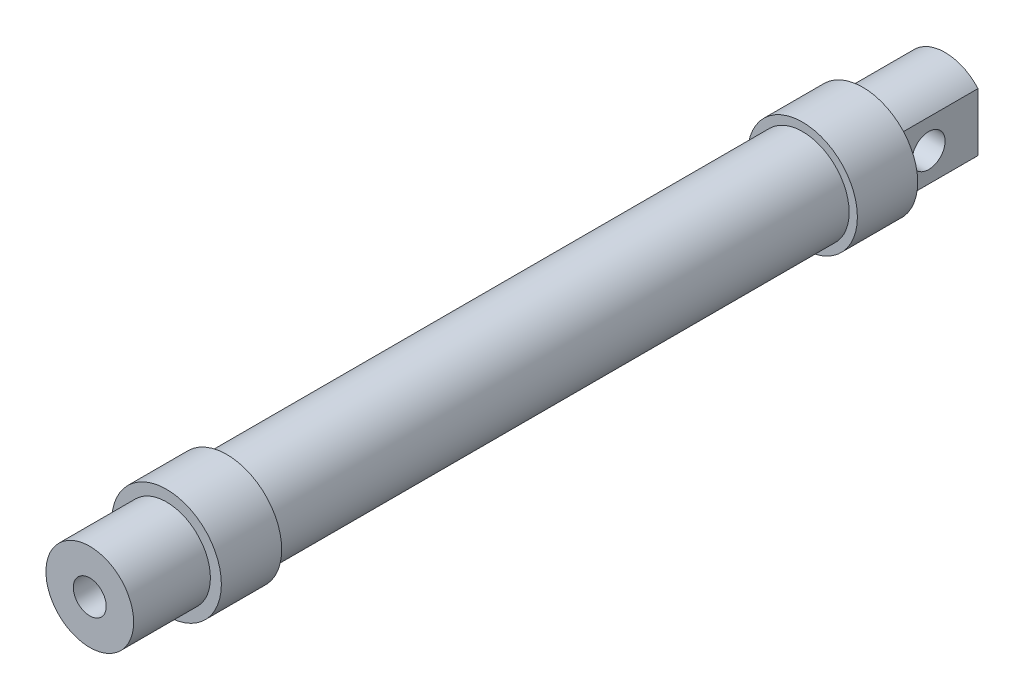
ISO-10303-21;
HEADER;
FILE_DESCRIPTION(('STEP AP214'),'2;1');
FILE_NAME('part.step','',(''),(''),'','','');
FILE_SCHEMA(('AUTOMOTIVE_DESIGN { 1 0 10303 214 1 1 1 1 }'));
ENDSEC;
DATA;
#1=APPLICATION_CONTEXT('core data for automotive mechanical design processes');
#2=APPLICATION_PROTOCOL_DEFINITION('international standard','automotive_design',2000,#1);
#3=PRODUCT_CONTEXT('',#1,'mechanical');
#4=PRODUCT('Part','Part','',(#3));
#5=PRODUCT_RELATED_PRODUCT_CATEGORY('part','',(#4));
#6=PRODUCT_DEFINITION_FORMATION('','',#4);
#7=PRODUCT_DEFINITION_CONTEXT('part definition',#1,'design');
#8=PRODUCT_DEFINITION('design','',#6,#7);
#9=PRODUCT_DEFINITION_SHAPE('','',#8);
#10=(LENGTH_UNIT() NAMED_UNIT(*) SI_UNIT(.MILLI.,.METRE.));
#11=(NAMED_UNIT(*) PLANE_ANGLE_UNIT() SI_UNIT($,.RADIAN.));
#12=(NAMED_UNIT(*) SI_UNIT($,.STERADIAN.) SOLID_ANGLE_UNIT());
#13=UNCERTAINTY_MEASURE_WITH_UNIT(LENGTH_MEASURE(1.E-05),#10,'distance_accuracy_value','');
#14=(GEOMETRIC_REPRESENTATION_CONTEXT(3) GLOBAL_UNCERTAINTY_ASSIGNED_CONTEXT((#13)) GLOBAL_UNIT_ASSIGNED_CONTEXT((#10,
#11,#12)) REPRESENTATION_CONTEXT('',''));
#15=CARTESIAN_POINT('',(0.,0.,0.));
#16=DIRECTION('',(0.,0.,1.));
#17=DIRECTION('',(1.,0.,0.));
#18=AXIS2_PLACEMENT_3D('',#15,#16,#17);
#19=CARTESIAN_POINT('',(0.,0.,15.));
#20=DIRECTION('',(0.,0.,-1.));
#21=DIRECTION('',(-1.,0.,0.));
#22=AXIS2_PLACEMENT_3D('',#19,#20,#21);
#23=CYLINDRICAL_SURFACE('',#22,8.);
#24=CARTESIAN_POINT('',(0.,0.,0.));
#25=DIRECTION('',(0.,0.,1.));
#26=DIRECTION('',(1.,0.,0.));
#27=AXIS2_PLACEMENT_3D('',#24,#25,#26);
#28=CIRCLE('',#27,8.);
#29=CARTESIAN_POINT('',(-6.,-5.29150262212918,0.));
#30=VERTEX_POINT('',#29);
#31=CARTESIAN_POINT('',(6.,-5.29150262212919,0.));
#32=VERTEX_POINT('',#31);
#33=EDGE_CURVE('E114',#30,#32,#28,.T.);
#34=ORIENTED_EDGE('',*,*,#33,.T.);
#35=DIRECTION('',(0.,0.,-1.));
#36=VECTOR('',#35,1.);
#37=CARTESIAN_POINT('',(6.,-5.29150262212919,15.));
#38=LINE('',#37,#36);
#39=CARTESIAN_POINT('',(6.,-5.29150262212919,15.));
#40=VERTEX_POINT('',#39);
#41=EDGE_CURVE('E89',#40,#32,#38,.T.);
#42=ORIENTED_EDGE('',*,*,#41,.F.);
#43=CARTESIAN_POINT('',(0.,0.,15.));
#44=DIRECTION('',(0.,0.,1.));
#45=DIRECTION('',(1.,0.,0.));
#46=AXIS2_PLACEMENT_3D('',#43,#44,#45);
#47=CIRCLE('',#46,8.);
#48=CARTESIAN_POINT('',(-6.,-5.29150262212918,15.));
#49=VERTEX_POINT('',#48);
#50=EDGE_CURVE('E93',#49,#40,#47,.T.);
#51=ORIENTED_EDGE('',*,*,#50,.F.);
#52=DIRECTION('',(0.,0.,-1.));
#53=VECTOR('',#52,1.);
#54=CARTESIAN_POINT('',(-6.,-5.29150262212918,15.));
#55=LINE('',#54,#53);
#56=EDGE_CURVE('E94',#49,#30,#55,.T.);
#57=ORIENTED_EDGE('',*,*,#56,.T.);
#58=EDGE_LOOP('',(#34,#42,#51,#57));
#59=FACE_BOUND('',#58,.T.);
#60=ADVANCED_FACE('F43',(#59),#23,.T.);
#61=CARTESIAN_POINT('',(6.,0.,15.));
#62=DIRECTION('',(1.,0.,0.));
#63=DIRECTION('',(0.,0.,-1.));
#64=AXIS2_PLACEMENT_3D('',#61,#62,#63);
#65=PLANE('',#64);
#66=CARTESIAN_POINT('',(6.,0.,9.));
#67=DIRECTION('',(-1.,0.,0.));
#68=DIRECTION('',(0.,0.,1.));
#69=AXIS2_PLACEMENT_3D('',#66,#67,#68);
#70=CIRCLE('',#69,3.);
#71=CARTESIAN_POINT('',(6.,0.,12.));
#72=VERTEX_POINT('',#71);
#73=EDGE_CURVE('E118',#72,#72,#70,.T.);
#74=ORIENTED_EDGE('',*,*,#73,.T.);
#75=EDGE_LOOP('',(#74));
#76=FACE_BOUND('',#75,.T.);
#77=DIRECTION('',(0.,-1.,0.));
#78=VECTOR('',#77,1.);
#79=CARTESIAN_POINT('',(6.,0.,0.));
#80=LINE('',#79,#78);
#81=CARTESIAN_POINT('',(6.,5.29150262212919,0.));
#82=VERTEX_POINT('',#81);
#83=EDGE_CURVE('E117',#82,#32,#80,.T.);
#84=ORIENTED_EDGE('',*,*,#83,.F.);
#85=DIRECTION('',(0.,0.,-1.));
#86=VECTOR('',#85,1.);
#87=CARTESIAN_POINT('',(6.,5.29150262212919,15.));
#88=LINE('',#87,#86);
#89=CARTESIAN_POINT('',(6.,5.29150262212919,15.));
#90=VERTEX_POINT('',#89);
#91=EDGE_CURVE('E126',#90,#82,#88,.T.);
#92=ORIENTED_EDGE('',*,*,#91,.F.);
#93=DIRECTION('',(0.,-1.,0.));
#94=VECTOR('',#93,1.);
#95=CARTESIAN_POINT('',(6.,0.,15.));
#96=LINE('',#95,#94);
#97=EDGE_CURVE('E100',#90,#40,#96,.T.);
#98=ORIENTED_EDGE('',*,*,#97,.T.);
#99=ORIENTED_EDGE('',*,*,#41,.T.);
#100=EDGE_LOOP('',(#84,#92,#98,#99));
#101=FACE_BOUND('',#100,.T.);
#102=ADVANCED_FACE('F45',(#76,#101),#65,.T.);
#103=CARTESIAN_POINT('',(-6.,5.29150262212918,0.));
#104=VERTEX_POINT('',#103);
#105=EDGE_CURVE('E78',#82,#104,#28,.T.);
#106=ORIENTED_EDGE('',*,*,#105,.T.);
#107=DIRECTION('',(0.,0.,-1.));
#108=VECTOR('',#107,1.);
#109=CARTESIAN_POINT('',(-6.,5.29150262212918,15.));
#110=LINE('',#109,#108);
#111=CARTESIAN_POINT('',(-6.,5.29150262212918,15.));
#112=VERTEX_POINT('',#111);
#113=EDGE_CURVE('E63',#112,#104,#110,.T.);
#114=ORIENTED_EDGE('',*,*,#113,.F.);
#115=EDGE_CURVE('E102',#90,#112,#47,.T.);
#116=ORIENTED_EDGE('',*,*,#115,.F.);
#117=ORIENTED_EDGE('',*,*,#91,.T.);
#118=EDGE_LOOP('',(#106,#114,#116,#117));
#119=FACE_BOUND('',#118,.T.);
#120=ADVANCED_FACE('F169',(#119),#23,.T.);
#121=CARTESIAN_POINT('',(-6.,0.,15.));
#122=DIRECTION('',(1.,0.,0.));
#123=DIRECTION('',(0.,0.,-1.));
#124=AXIS2_PLACEMENT_3D('',#121,#122,#123);
#125=PLANE('',#124);
#126=CARTESIAN_POINT('',(-6.,0.,9.));
#127=DIRECTION('',(-1.,0.,0.));
#128=DIRECTION('',(0.,0.,1.));
#129=AXIS2_PLACEMENT_3D('',#126,#127,#128);
#130=CIRCLE('',#129,3.);
#131=CARTESIAN_POINT('',(-6.,0.,12.));
#132=VERTEX_POINT('',#131);
#133=EDGE_CURVE('E187',#132,#132,#130,.T.);
#134=ORIENTED_EDGE('',*,*,#133,.F.);
#135=EDGE_LOOP('',(#134));
#136=FACE_BOUND('',#135,.T.);
#137=DIRECTION('',(0.,-1.,0.));
#138=VECTOR('',#137,1.);
#139=CARTESIAN_POINT('',(-6.,0.,0.));
#140=LINE('',#139,#138);
#141=EDGE_CURVE('E83',#104,#30,#140,.T.);
#142=ORIENTED_EDGE('',*,*,#141,.T.);
#143=ORIENTED_EDGE('',*,*,#56,.F.);
#144=DIRECTION('',(0.,-1.,0.));
#145=VECTOR('',#144,1.);
#146=CARTESIAN_POINT('',(-6.,0.,15.));
#147=LINE('',#146,#145);
#148=EDGE_CURVE('E104',#112,#49,#147,.T.);
#149=ORIENTED_EDGE('',*,*,#148,.F.);
#150=ORIENTED_EDGE('',*,*,#113,.T.);
#151=EDGE_LOOP('',(#142,#143,#149,#150));
#152=FACE_BOUND('',#151,.T.);
#153=ADVANCED_FACE('F103',(#136,#152),#125,.F.);
#154=CARTESIAN_POINT('',(0.,0.,0.));
#155=DIRECTION('',(0.,0.,1.));
#156=DIRECTION('',(1.,0.,0.));
#157=AXIS2_PLACEMENT_3D('',#154,#155,#156);
#158=PLANE('',#157);
#159=ORIENTED_EDGE('',*,*,#33,.F.);
#160=ORIENTED_EDGE('',*,*,#141,.F.);
#161=ORIENTED_EDGE('',*,*,#105,.F.);
#162=ORIENTED_EDGE('',*,*,#83,.T.);
#163=EDGE_LOOP('',(#159,#160,#161,#162));
#164=FACE_BOUND('',#163,.T.);
#165=ADVANCED_FACE('F165',(#164),#158,.F.);
#166=CARTESIAN_POINT('',(6.,0.,9.));
#167=DIRECTION('',(-1.,0.,0.));
#168=DIRECTION('',(0.,0.,1.));
#169=AXIS2_PLACEMENT_3D('',#166,#167,#168);
#170=CYLINDRICAL_SURFACE('',#169,3.);
#171=ORIENTED_EDGE('',*,*,#73,.F.);
#172=EDGE_LOOP('',(#171));
#173=FACE_BOUND('',#172,.T.);
#174=ORIENTED_EDGE('',*,*,#133,.T.);
#175=EDGE_LOOP('',(#174));
#176=FACE_BOUND('',#175,.T.);
#177=ADVANCED_FACE('F158',(#173,#176),#170,.F.);
#178=CARTESIAN_POINT('',(0.,0.,15.));
#179=DIRECTION('',(0.,0.,1.));
#180=DIRECTION('',(1.,0.,0.));
#181=AXIS2_PLACEMENT_3D('',#178,#179,#180);
#182=PLANE('',#181);
#183=CARTESIAN_POINT('',(0.,0.,15.));
#184=DIRECTION('',(0.,0.,1.));
#185=DIRECTION('',(1.,0.,0.));
#186=AXIS2_PLACEMENT_3D('',#183,#184,#185);
#187=CIRCLE('',#186,10.);
#188=CARTESIAN_POINT('',(10.,0.,15.));
#189=VERTEX_POINT('',#188);
#190=EDGE_CURVE('E197',#189,#189,#187,.T.);
#191=ORIENTED_EDGE('',*,*,#190,.F.);
#192=EDGE_LOOP('',(#191));
#193=FACE_BOUND('',#192,.T.);
#194=ORIENTED_EDGE('',*,*,#148,.T.);
#195=ORIENTED_EDGE('',*,*,#50,.T.);
#196=ORIENTED_EDGE('',*,*,#97,.F.);
#197=ORIENTED_EDGE('',*,*,#115,.T.);
#198=EDGE_LOOP('',(#194,#195,#196,#197));
#199=FACE_BOUND('',#198,.T.);
#200=ADVANCED_FACE('F108',(#193,#199),#182,.F.);
#201=CARTESIAN_POINT('',(0.,0.,26.));
#202=DIRECTION('',(0.,0.,-1.));
#203=DIRECTION('',(-1.,0.,0.));
#204=AXIS2_PLACEMENT_3D('',#201,#202,#203);
#205=CYLINDRICAL_SURFACE('',#204,10.);
#206=CARTESIAN_POINT('',(0.,-10.,23.));
#207=CARTESIAN_POINT('',(0.138126814449552,-9.99999766446687,22.9999961237697));
#208=CARTESIAN_POINT('',(0.276296929717938,-9.99710963553044,22.9885140820437));
#209=CARTESIAN_POINT('',(0.548677206284221,-9.98586856383157,22.942958081155));
#210=CARTESIAN_POINT('',(0.682885078117899,-9.97751242366627,22.9088713174369));
#211=CARTESIAN_POINT('',(0.943368120304295,-9.9562604388672,22.8192679108965));
#212=CARTESIAN_POINT('',(1.06965260571667,-9.94337004736764,22.7637770021412));
#213=CARTESIAN_POINT('',(1.31112021984071,-9.91442239679369,22.6330310165919));
#214=CARTESIAN_POINT('',(1.42630297391461,-9.89836503090261,22.5577752731351));
#215=CARTESIAN_POINT('',(1.64466987883486,-9.86445689319489,22.3879986839097));
#216=CARTESIAN_POINT('',(1.74759281676843,-9.84657845246877,22.2931473750682));
#217=CARTESIAN_POINT('',(1.93624821200553,-9.8112270019656,22.0875796584849));
#218=CARTESIAN_POINT('',(2.02197872824865,-9.79375403816446,21.9768614617551));
#219=CARTESIAN_POINT('',(2.17504423799829,-9.76091292830281,21.740674622105));
#220=CARTESIAN_POINT('',(2.2420870265419,-9.74557990774685,21.6150112819854));
#221=CARTESIAN_POINT('',(2.35399484758457,-9.71915824696694,21.3537526472333));
#222=CARTESIAN_POINT('',(2.39886342573357,-9.70806892824031,21.2181589444466));
#223=CARTESIAN_POINT('',(2.46425806134127,-9.69167461160538,20.9437608363306));
#224=CARTESIAN_POINT('',(2.48525378055342,-9.68625818328352,20.80507517327));
#225=CARTESIAN_POINT('',(2.50376962511068,-9.68148937432652,20.5260523850011));
#226=CARTESIAN_POINT('',(2.50129356969685,-9.68213600713214,20.3857155321798));
#227=CARTESIAN_POINT('',(2.47331087439951,-9.68932009194695,20.1109736537577));
#228=CARTESIAN_POINT('',(2.44836390031772,-9.69571438345489,19.9765072975578));
#229=CARTESIAN_POINT('',(2.37704031150499,-9.71344516118448,19.7137315818149));
#230=CARTESIAN_POINT('',(2.33066217011566,-9.72478199948731,19.5854226616185));
#231=CARTESIAN_POINT('',(2.21731579656198,-9.75125189842765,19.3371033062465));
#232=CARTESIAN_POINT('',(2.1501444453882,-9.76642212449693,19.217189713684));
#233=CARTESIAN_POINT('',(1.99726046002491,-9.79882851409985,18.9901354837386));
#234=CARTESIAN_POINT('',(1.91154458134806,-9.81606503891047,18.8829970865546));
#235=CARTESIAN_POINT('',(1.72110570780203,-9.85126467566485,18.681327307176));
#236=CARTESIAN_POINT('',(1.61591043027643,-9.86923449130002,18.5872425165644));
#237=CARTESIAN_POINT('',(1.39101986250617,-9.90343275964594,18.4179645958935));
#238=CARTESIAN_POINT('',(1.27132412951324,-9.91966115915679,18.3427720428941));
#239=CARTESIAN_POINT('',(1.02019314780232,-9.94862886823651,18.2132490229594));
#240=CARTESIAN_POINT('',(0.888718988681039,-9.96135600212879,18.1589910995759));
#241=CARTESIAN_POINT('',(0.618126680238138,-9.98179861652361,18.0734711571507));
#242=CARTESIAN_POINT('',(0.479009998584142,-9.98951505565468,18.0422047393031));
#243=CARTESIAN_POINT('',(0.200899950650046,-9.99892498785624,18.0042373907353));
#244=CARTESIAN_POINT('',(0.0619945333136846,-10.0007675584713,17.9969282898745));
#245=CARTESIAN_POINT('',(-0.215054791335846,-9.99864674690754,18.0054150034258));
#246=CARTESIAN_POINT('',(-0.353198766074326,-9.99468388736421,18.0212087379986));
#247=CARTESIAN_POINT('',(-0.622690447960817,-9.98149301878918,18.0749515139856));
#248=CARTESIAN_POINT('',(-0.754108531614584,-9.97234390309647,18.1125687724616));
#249=CARTESIAN_POINT('',(-1.00876215408753,-9.94981177723595,18.2085118067141));
#250=CARTESIAN_POINT('',(-1.13199686505442,-9.93642833949965,18.2668396738554));
#251=CARTESIAN_POINT('',(-1.36920522404972,-9.9065551321037,18.4037268814578));
#252=CARTESIAN_POINT('',(-1.48297573639294,-9.89001445610999,18.4826268539943));
#253=CARTESIAN_POINT('',(-1.69587768940552,-9.85574181979586,18.6579831813286));
#254=CARTESIAN_POINT('',(-1.79500659828875,-9.83800965421578,18.7544425660294));
#255=CARTESIAN_POINT('',(-1.97831761345414,-9.80281594932498,18.9650032680728));
#256=CARTESIAN_POINT('',(-2.06207311270184,-9.78537173637463,19.0794795049993));
#257=CARTESIAN_POINT('',(-2.20918459835604,-9.75321463970069,19.3212210574476));
#258=CARTESIAN_POINT('',(-2.27254149026901,-9.73850163474941,19.4484858049507));
#259=CARTESIAN_POINT('',(-2.37658570101223,-9.71363491194665,19.7115095373437));
#260=CARTESIAN_POINT('',(-2.41740732773931,-9.70345425375809,19.8472127138538));
#261=CARTESIAN_POINT('',(-2.47557609990489,-9.68877906706585,20.1238493964255));
#262=CARTESIAN_POINT('',(-2.49292837912652,-9.68428329504044,20.2647817517024));
#263=CARTESIAN_POINT('',(-2.50339765056083,-9.68158168701612,20.5435350397693));
#264=CARTESIAN_POINT('',(-2.49719649630131,-9.68319887888035,20.6813290585441));
#265=CARTESIAN_POINT('',(-2.46229546385366,-9.69213181672143,20.9538398144438));
#266=CARTESIAN_POINT('',(-2.43359603781098,-9.69944744817731,21.0885566133553));
#267=CARTESIAN_POINT('',(-2.35488553240495,-9.71885434473222,21.3503474317764));
#268=CARTESIAN_POINT('',(-2.30500234113404,-9.73091692061057,21.4774621754005));
#269=CARTESIAN_POINT('',(-2.18544152267504,-9.7584625954084,21.7216089711893));
#270=CARTESIAN_POINT('',(-2.11576115005696,-9.77394616867808,21.8386396219781));
#271=CARTESIAN_POINT('',(-1.95644624772858,-9.80709390439337,22.0625910483368));
#272=CARTESIAN_POINT('',(-1.86633860485376,-9.82480441386302,22.1691684557066));
#273=CARTESIAN_POINT('',(-1.66964895198288,-9.86013378743769,22.3659117413257));
#274=CARTESIAN_POINT('',(-1.56306303543524,-9.87775262878422,22.4560737168549));
#275=CARTESIAN_POINT('',(-1.33411264450432,-9.9112942607945,22.6190188476077));
#276=CARTESIAN_POINT('',(-1.21149737052731,-9.92718055609783,22.6914576894526));
#277=CARTESIAN_POINT('',(-0.955443432517459,-9.95508208291861,22.8145791049009));
#278=CARTESIAN_POINT('',(-0.8220126057279,-9.96710008666302,22.8652772677476));
#279=CARTESIAN_POINT('',(-0.574017088739121,-9.98413432609236,22.9359530505494));
#280=CARTESIAN_POINT('',(-0.460633618180115,-9.99004308421151,22.9599187384224));
#281=CARTESIAN_POINT('',(-0.231510119227139,-9.9979767538658,22.9919432393699));
#282=CARTESIAN_POINT('',(-0.115770268737694,-10.0000019575149,23.0000032488422));
#283=CARTESIAN_POINT('',(0.,-10.,23.));
#284=B_SPLINE_CURVE_WITH_KNOTS('',3,(#206,#207,#208,#209,#210,#211,#212,#213,#214,#215,#216,
#217,#218,#219,#220,#221,#222,#223,#224,#225,#226,#227,#228,#229,#230,#231,#232,#233,#234,#235,
#236,#237,#238,#239,#240,#241,#242,#243,#244,#245,#246,#247,#248,#249,#250,#251,#252,#253,#254,
#255,#256,#257,#258,#259,#260,#261,#262,#263,#264,#265,#266,#267,#268,#269,#270,#271,#272,#273,
#274,#275,#276,#277,#278,#279,#280,#281,#282,#283),.UNSPECIFIED.,.T.,.F.,(4,2,2,2,2,2,2,2,2,2,2,
2,2,2,2,2,2,2,2,2,2,2,2,2,2,2,2,2,2,2,2,2,2,2,2,2,2,2,4),(0.,0.41395618745315,0.828147062939832,
1.24184150381018,1.65554990028221,2.07690725728565,2.4983121596677,2.92597745909678,
3.35357435282281,3.77260491835117,4.19156730193363,4.60037495017231,5.00921172448932,
5.42217546462,5.83521151399139,6.26002501620567,6.6848514926928,7.11113715020724,
7.53734122819939,7.95263848254328,8.36789835193439,8.7770045752893,9.18615212209352,
9.60255979281121,10.0190393835223,10.4457418201299,10.8724253125471,11.2965375769764,
11.7205570543048,12.1323963400748,12.5442273493652,12.9536066760888,13.3630428023797,
13.7831596069298,14.2033761629383,14.6312030917578,15.0587227304538,15.4057040491338,
15.752659267482),.UNSPECIFIED.);
#285=CARTESIAN_POINT('',(0.,-10.,23.));
#286=VERTEX_POINT('',#285);
#287=EDGE_CURVE('E131',#286,#286,#284,.T.);
#288=ORIENTED_EDGE('',*,*,#287,.T.);
#289=EDGE_LOOP('',(#288));
#290=FACE_BOUND('',#289,.T.);
#291=CARTESIAN_POINT('',(0.,0.,26.));
#292=DIRECTION('',(0.,0.,1.));
#293=DIRECTION('',(1.,0.,0.));
#294=AXIS2_PLACEMENT_3D('',#291,#292,#293);
#295=CIRCLE('',#294,10.);
#296=CARTESIAN_POINT('',(10.,0.,26.));
#297=VERTEX_POINT('',#296);
#298=EDGE_CURVE('E190',#297,#297,#295,.T.);
#299=ORIENTED_EDGE('',*,*,#298,.F.);
#300=EDGE_LOOP('',(#299));
#301=FACE_BOUND('',#300,.T.);
#302=ORIENTED_EDGE('',*,*,#190,.T.);
#303=EDGE_LOOP('',(#302));
#304=FACE_BOUND('',#303,.T.);
#305=ADVANCED_FACE('F141',(#290,#301,#304),#205,.T.);
#306=CARTESIAN_POINT('',(0.,0.,26.));
#307=DIRECTION('',(0.,0.,1.));
#308=DIRECTION('',(1.,0.,0.));
#309=AXIS2_PLACEMENT_3D('',#306,#307,#308);
#310=PLANE('',#309);
#311=CARTESIAN_POINT('',(0.,0.,26.));
#312=DIRECTION('',(0.,0.,1.));
#313=DIRECTION('',(1.,0.,0.));
#314=AXIS2_PLACEMENT_3D('',#311,#312,#313);
#315=CIRCLE('',#314,8.5);
#316=CARTESIAN_POINT('',(8.5,0.,26.));
#317=VERTEX_POINT('',#316);
#318=EDGE_CURVE('E208',#317,#317,#315,.T.);
#319=ORIENTED_EDGE('',*,*,#318,.F.);
#320=EDGE_LOOP('',(#319));
#321=FACE_BOUND('',#320,.T.);
#322=ORIENTED_EDGE('',*,*,#298,.T.);
#323=EDGE_LOOP('',(#322));
#324=FACE_BOUND('',#323,.T.);
#325=ADVANCED_FACE('F151',(#321,#324),#310,.T.);
#326=CARTESIAN_POINT('',(0.,-10.,20.5));
#327=DIRECTION('',(0.,1.,0.));
#328=DIRECTION('',(0.,0.,1.));
#329=AXIS2_PLACEMENT_3D('',#326,#327,#328);
#330=CYLINDRICAL_SURFACE('',#329,2.5);
#331=CARTESIAN_POINT('',(0.,0.,20.5));
#332=DIRECTION('',(0.,1.,0.));
#333=DIRECTION('',(0.,0.,1.));
#334=AXIS2_PLACEMENT_3D('',#331,#332,#333);
#335=CIRCLE('',#334,2.5);
#336=CARTESIAN_POINT('',(0.,0.,23.));
#337=VERTEX_POINT('',#336);
#338=EDGE_CURVE('E202',#337,#337,#335,.T.);
#339=ORIENTED_EDGE('',*,*,#338,.T.);
#340=EDGE_LOOP('',(#339));
#341=FACE_BOUND('',#340,.T.);
#342=ORIENTED_EDGE('',*,*,#287,.F.);
#343=EDGE_LOOP('',(#342));
#344=FACE_BOUND('',#343,.T.);
#345=ADVANCED_FACE('F145',(#341,#344),#330,.F.);
#346=CARTESIAN_POINT('',(0.,0.,20.5));
#347=DIRECTION('',(0.,1.,0.));
#348=DIRECTION('',(0.,0.,1.));
#349=AXIS2_PLACEMENT_3D('',#346,#347,#348);
#350=PLANE('',#349);
#351=ORIENTED_EDGE('',*,*,#338,.F.);
#352=EDGE_LOOP('',(#351));
#353=FACE_BOUND('',#352,.T.);
#354=ADVANCED_FACE('F150',(#353),#350,.F.);
#355=CARTESIAN_POINT('',(0.,0.,131.));
#356=DIRECTION('',(0.,0.,-1.));
#357=DIRECTION('',(-1.,0.,0.));
#358=AXIS2_PLACEMENT_3D('',#355,#356,#357);
#359=CYLINDRICAL_SURFACE('',#358,8.5);
#360=CARTESIAN_POINT('',(0.,0.,131.));
#361=DIRECTION('',(0.,0.,1.));
#362=DIRECTION('',(1.,0.,0.));
#363=AXIS2_PLACEMENT_3D('',#360,#361,#362);
#364=CIRCLE('',#363,8.5);
#365=CARTESIAN_POINT('',(8.5,0.,131.));
#366=VERTEX_POINT('',#365);
#367=EDGE_CURVE('E207',#366,#366,#364,.T.);
#368=ORIENTED_EDGE('',*,*,#367,.F.);
#369=EDGE_LOOP('',(#368));
#370=FACE_BOUND('',#369,.T.);
#371=ORIENTED_EDGE('',*,*,#318,.T.);
#372=EDGE_LOOP('',(#371));
#373=FACE_BOUND('',#372,.T.);
#374=ADVANCED_FACE('F273',(#370,#373),#359,.T.);
#375=CARTESIAN_POINT('',(0.,0.,142.));
#376=DIRECTION('',(0.,0.,-1.));
#377=DIRECTION('',(-1.,0.,0.));
#378=AXIS2_PLACEMENT_3D('',#375,#376,#377);
#379=CYLINDRICAL_SURFACE('',#378,10.);
#380=CARTESIAN_POINT('',(0.,-10.,139.));
#381=CARTESIAN_POINT('',(0.138126814449551,-9.99999766446687,138.99999612377));
#382=CARTESIAN_POINT('',(0.276296929717937,-9.99710963553043,138.988514082044));
#383=CARTESIAN_POINT('',(0.548677206284219,-9.98586856383157,138.942958081155));
#384=CARTESIAN_POINT('',(0.682885078117897,-9.97751242366627,138.908871317437));
#385=CARTESIAN_POINT('',(0.943368120304293,-9.9562604388672,138.819267910897));
#386=CARTESIAN_POINT('',(1.06965260571667,-9.94337004736764,138.763777002141));
#387=CARTESIAN_POINT('',(1.31112021984071,-9.91442239679369,138.633031016592));
#388=CARTESIAN_POINT('',(1.4263029739146,-9.89836503090261,138.557775273135));
#389=CARTESIAN_POINT('',(1.64466987883485,-9.86445689319489,138.38799868391));
#390=CARTESIAN_POINT('',(1.74759281676842,-9.84657845246877,138.293147375068));
#391=CARTESIAN_POINT('',(1.93624821200553,-9.81122700196561,138.087579658485));
#392=CARTESIAN_POINT('',(2.02197872824865,-9.79375403816446,137.976861461755));
#393=CARTESIAN_POINT('',(2.17504423799829,-9.76091292830281,137.740674622105));
#394=CARTESIAN_POINT('',(2.24208702654191,-9.74557990774685,137.615011281985));
#395=CARTESIAN_POINT('',(2.35399484758458,-9.71915824696694,137.353752647233));
#396=CARTESIAN_POINT('',(2.39886342573357,-9.70806892824031,137.218158944447));
#397=CARTESIAN_POINT('',(2.46425806134127,-9.69167461160538,136.943760836331));
#398=CARTESIAN_POINT('',(2.48525378055342,-9.68625818328352,136.80507517327));
#399=CARTESIAN_POINT('',(2.50376962511068,-9.68148937432652,136.526052385001));
#400=CARTESIAN_POINT('',(2.50129356969685,-9.68213600713214,136.38571553218));
#401=CARTESIAN_POINT('',(2.47331087439951,-9.68932009194695,136.110973653758));
#402=CARTESIAN_POINT('',(2.44836390031772,-9.69571438345489,135.976507297558));
#403=CARTESIAN_POINT('',(2.37704031150499,-9.71344516118448,135.713731581815));
#404=CARTESIAN_POINT('',(2.33066217011567,-9.72478199948731,135.585422661618));
#405=CARTESIAN_POINT('',(2.21731579656199,-9.75125189842765,135.337103306246));
#406=CARTESIAN_POINT('',(2.15014444538821,-9.76642212449693,135.217189713684));
#407=CARTESIAN_POINT('',(1.99726046002492,-9.79882851409985,134.990135483739));
#408=CARTESIAN_POINT('',(1.91154458134807,-9.81606503891046,134.882997086555));
#409=CARTESIAN_POINT('',(1.72110570780204,-9.85126467566485,134.681327307176));
#410=CARTESIAN_POINT('',(1.61591043027643,-9.86923449130002,134.587242516564));
#411=CARTESIAN_POINT('',(1.39101986250616,-9.90343275964594,134.417964595893));
#412=CARTESIAN_POINT('',(1.27132412951324,-9.91966115915679,134.342772042894));
#413=CARTESIAN_POINT('',(1.02019314780232,-9.94862886823651,134.213249022959));
#414=CARTESIAN_POINT('',(0.888718988681038,-9.96135600212879,134.158991099576));
#415=CARTESIAN_POINT('',(0.618126680238132,-9.98179861652361,134.073471157151));
#416=CARTESIAN_POINT('',(0.479009998584132,-9.98951505565468,134.042204739303));
#417=CARTESIAN_POINT('',(0.200899950650036,-9.99892498785624,134.004237390735));
#418=CARTESIAN_POINT('',(0.0619945333136764,-10.0007675584713,133.996928289874));
#419=CARTESIAN_POINT('',(-0.215054791335851,-9.99864674690754,134.005415003426));
#420=CARTESIAN_POINT('',(-0.353198766074329,-9.99468388736421,134.021208737999));
#421=CARTESIAN_POINT('',(-0.622690447960822,-9.98149301878918,134.074951513986));
#422=CARTESIAN_POINT('',(-0.754108531614592,-9.97234390309647,134.112568772462));
#423=CARTESIAN_POINT('',(-1.00876215408754,-9.94981177723595,134.208511806714));
#424=CARTESIAN_POINT('',(-1.13199686505443,-9.93642833949965,134.266839673855));
#425=CARTESIAN_POINT('',(-1.36920522404972,-9.9065551321037,134.403726881458));
#426=CARTESIAN_POINT('',(-1.48297573639294,-9.89001445610999,134.482626853994));
#427=CARTESIAN_POINT('',(-1.69587768940551,-9.85574181979587,134.657983181329));
#428=CARTESIAN_POINT('',(-1.79500659828874,-9.83800965421578,134.754442566029));
#429=CARTESIAN_POINT('',(-1.97831761345413,-9.80281594932498,134.965003268073));
#430=CARTESIAN_POINT('',(-2.06207311270183,-9.78537173637464,135.079479504999));
#431=CARTESIAN_POINT('',(-2.20918459835604,-9.75321463970069,135.321221057448));
#432=CARTESIAN_POINT('',(-2.27254149026901,-9.73850163474941,135.448485804951));
#433=CARTESIAN_POINT('',(-2.37658570101223,-9.71363491194665,135.711509537344));
#434=CARTESIAN_POINT('',(-2.41740732773931,-9.70345425375809,135.847212713854));
#435=CARTESIAN_POINT('',(-2.47557609990489,-9.68877906706586,136.123849396425));
#436=CARTESIAN_POINT('',(-2.49292837912652,-9.68428329504044,136.264781751702));
#437=CARTESIAN_POINT('',(-2.50339765056083,-9.68158168701612,136.543535039769));
#438=CARTESIAN_POINT('',(-2.49719649630132,-9.68319887888034,136.681329058544));
#439=CARTESIAN_POINT('',(-2.46229546385366,-9.69213181672143,136.953839814444));
#440=CARTESIAN_POINT('',(-2.43359603781098,-9.69944744817731,137.088556613355));
#441=CARTESIAN_POINT('',(-2.35488553240495,-9.71885434473222,137.350347431776));
#442=CARTESIAN_POINT('',(-2.30500234113403,-9.73091692061057,137.477462175401));
#443=CARTESIAN_POINT('',(-2.18544152267503,-9.7584625954084,137.721608971189));
#444=CARTESIAN_POINT('',(-2.11576115005696,-9.77394616867808,137.838639621978));
#445=CARTESIAN_POINT('',(-1.95644624772859,-9.80709390439337,138.062591048337));
#446=CARTESIAN_POINT('',(-1.86633860485377,-9.82480441386302,138.169168455707));
#447=CARTESIAN_POINT('',(-1.66964895198288,-9.86013378743769,138.365911741326));
#448=CARTESIAN_POINT('',(-1.56306303543523,-9.87775262878422,138.456073716855));
#449=CARTESIAN_POINT('',(-1.33411264450431,-9.91129426079449,138.619018847608));
#450=CARTESIAN_POINT('',(-1.21149737052731,-9.92718055609783,138.691457689453));
#451=CARTESIAN_POINT('',(-0.955443432517465,-9.95508208291861,138.814579104901));
#452=CARTESIAN_POINT('',(-0.822012605727904,-9.96710008666301,138.865277267748));
#453=CARTESIAN_POINT('',(-0.574017088739125,-9.98413432609236,138.935953050549));
#454=CARTESIAN_POINT('',(-0.460633618180119,-9.99004308421151,138.959918738422));
#455=CARTESIAN_POINT('',(-0.231510119227141,-9.9979767538658,138.99194323937));
#456=CARTESIAN_POINT('',(-0.115770268737695,-10.0000019575149,139.000003248842));
#457=CARTESIAN_POINT('',(0.,-10.,139.));
#458=B_SPLINE_CURVE_WITH_KNOTS('',3,(#380,#381,#382,#383,#384,#385,#386,#387,#388,#389,#390,
#391,#392,#393,#394,#395,#396,#397,#398,#399,#400,#401,#402,#403,#404,#405,#406,#407,#408,#409,
#410,#411,#412,#413,#414,#415,#416,#417,#418,#419,#420,#421,#422,#423,#424,#425,#426,#427,#428,
#429,#430,#431,#432,#433,#434,#435,#436,#437,#438,#439,#440,#441,#442,#443,#444,#445,#446,#447,
#448,#449,#450,#451,#452,#453,#454,#455,#456,#457),.UNSPECIFIED.,.T.,.F.,(4,2,2,2,2,2,2,2,2,2,2,
2,2,2,2,2,2,2,2,2,2,2,2,2,2,2,2,2,2,2,2,2,2,2,2,2,2,2,4),(0.,0.413956187453146,
0.828147062939834,1.24184150381017,1.65554990028221,2.07690725728564,2.4983121596677,
2.92597745909682,3.3535743528228,3.77260491835115,4.19156730193363,4.6003749501723,
5.0092117244893,5.42217546461997,5.83521151399138,6.26002501620569,6.68485149269279,
7.11113715020726,7.53734122819941,7.95263848254329,8.3678983519344,8.77700457528932,
9.18615212209352,9.60255979281121,10.0190393835223,10.4457418201299,10.8724253125472,
11.2965375769764,11.7205570543047,12.1323963400749,12.5442273493652,12.9536066760888,
13.3630428023797,13.7831596069298,14.2033761629383,14.6312030917578,15.0587227304538,
15.4057040491338,15.752659267482),.UNSPECIFIED.);
#459=CARTESIAN_POINT('',(0.,-10.,139.));
#460=VERTEX_POINT('',#459);
#461=EDGE_CURVE('E54',#460,#460,#458,.T.);
#462=ORIENTED_EDGE('',*,*,#461,.T.);
#463=EDGE_LOOP('',(#462));
#464=FACE_BOUND('',#463,.T.);
#465=CARTESIAN_POINT('',(0.,0.,142.));
#466=DIRECTION('',(0.,0.,1.));
#467=DIRECTION('',(1.,0.,0.));
#468=AXIS2_PLACEMENT_3D('',#465,#466,#467);
#469=CIRCLE('',#468,10.);
#470=CARTESIAN_POINT('',(10.,0.,142.));
#471=VERTEX_POINT('',#470);
#472=EDGE_CURVE('E219',#471,#471,#469,.T.);
#473=ORIENTED_EDGE('',*,*,#472,.F.);
#474=EDGE_LOOP('',(#473));
#475=FACE_BOUND('',#474,.T.);
#476=CARTESIAN_POINT('',(0.,0.,131.));
#477=DIRECTION('',(0.,0.,1.));
#478=DIRECTION('',(1.,0.,0.));
#479=AXIS2_PLACEMENT_3D('',#476,#477,#478);
#480=CIRCLE('',#479,10.);
#481=CARTESIAN_POINT('',(10.,0.,131.));
#482=VERTEX_POINT('',#481);
#483=EDGE_CURVE('E220',#482,#482,#480,.T.);
#484=ORIENTED_EDGE('',*,*,#483,.T.);
#485=EDGE_LOOP('',(#484));
#486=FACE_BOUND('',#485,.T.);
#487=ADVANCED_FACE('F268',(#464,#475,#486),#379,.T.);
#488=CARTESIAN_POINT('',(0.,0.,142.));
#489=DIRECTION('',(0.,0.,1.));
#490=DIRECTION('',(1.,0.,0.));
#491=AXIS2_PLACEMENT_3D('',#488,#489,#490);
#492=PLANE('',#491);
#493=CARTESIAN_POINT('',(0.,0.,142.));
#494=DIRECTION('',(0.,0.,1.));
#495=DIRECTION('',(1.,0.,0.));
#496=AXIS2_PLACEMENT_3D('',#493,#494,#495);
#497=CIRCLE('',#496,8.);
#498=CARTESIAN_POINT('',(8.,0.,142.));
#499=VERTEX_POINT('',#498);
#500=EDGE_CURVE('E11',#499,#499,#497,.T.);
#501=ORIENTED_EDGE('',*,*,#500,.F.);
#502=EDGE_LOOP('',(#501));
#503=FACE_BOUND('',#502,.T.);
#504=ORIENTED_EDGE('',*,*,#472,.T.);
#505=EDGE_LOOP('',(#504));
#506=FACE_BOUND('',#505,.T.);
#507=ADVANCED_FACE('F265',(#503,#506),#492,.T.);
#508=CARTESIAN_POINT('',(0.,0.,131.));
#509=DIRECTION('',(0.,0.,1.));
#510=DIRECTION('',(1.,0.,0.));
#511=AXIS2_PLACEMENT_3D('',#508,#509,#510);
#512=PLANE('',#511);
#513=ORIENTED_EDGE('',*,*,#367,.T.);
#514=EDGE_LOOP('',(#513));
#515=FACE_BOUND('',#514,.T.);
#516=ORIENTED_EDGE('',*,*,#483,.F.);
#517=EDGE_LOOP('',(#516));
#518=FACE_BOUND('',#517,.T.);
#519=ADVANCED_FACE('F259',(#515,#518),#512,.F.);
#520=CARTESIAN_POINT('',(0.,-10.,136.5));
#521=DIRECTION('',(0.,1.,0.));
#522=DIRECTION('',(0.,0.,1.));
#523=AXIS2_PLACEMENT_3D('',#520,#521,#522);
#524=CYLINDRICAL_SURFACE('',#523,2.5);
#525=CARTESIAN_POINT('',(0.,-3.,139.));
#526=CARTESIAN_POINT('',(0.118757533193204,-2.99999522795205,138.999995114446));
#527=CARTESIAN_POINT('',(0.237551281104128,-2.99288670594742,138.991477496095));
#528=CARTESIAN_POINT('',(0.471182492492811,-2.96510762868268,138.958037276648));
#529=CARTESIAN_POINT('',(0.586016959612418,-2.94442702942007,138.933102526025));
#530=CARTESIAN_POINT('',(0.807829942407297,-2.89142690238865,138.868687882667));
#531=CARTESIAN_POINT('',(0.9148509209049,-2.8591769655007,138.829294925646));
#532=CARTESIAN_POINT('',(1.11984139043408,-2.78529176182903,138.737982952057));
#533=CARTESIAN_POINT('',(1.21780780775234,-2.74365332434936,138.686059703327));
#534=CARTESIAN_POINT('',(1.43789998519767,-2.63674191529867,138.550546250192));
#535=CARTESIAN_POINT('',(1.55568219657219,-2.56840549256192,138.462329795818));
#536=CARTESIAN_POINT('',(1.77202398328146,-2.42422624777674,138.269475674249));
#537=CARTESIAN_POINT('',(1.87052845158604,-2.34836281453277,138.164792430757));
#538=CARTESIAN_POINT('',(2.00437263805588,-2.23294886313738,137.995915723509));
#539=CARTESIAN_POINT('',(2.04699726278815,-2.19383679994997,137.937044423809));
#540=CARTESIAN_POINT('',(2.12715295529554,-2.11620611809194,137.81549439704));
#541=CARTESIAN_POINT('',(2.16468231743738,-2.07768770195024,137.752814405129));
#542=CARTESIAN_POINT('',(2.23441122570746,-2.00250543288662,137.623732675664));
#543=CARTESIAN_POINT('',(2.26662332666226,-1.96583735754651,137.557340215275));
#544=CARTESIAN_POINT('',(2.32553690612793,-1.89577686630311,137.420553716072));
#545=CARTESIAN_POINT('',(2.3522430799868,-1.86238167220904,137.350163152658));
#546=CARTESIAN_POINT('',(2.40193513934006,-1.79791918980412,137.1983329098));
#547=CARTESIAN_POINT('',(2.42433807692598,-1.76736311251003,137.116475907277));
#548=CARTESIAN_POINT('',(2.46101313675502,-1.71593180556003,136.948110231187));
#549=CARTESIAN_POINT('',(2.47530499393793,-1.69503310194196,136.861613413385));
#550=CARTESIAN_POINT('',(2.49481072799048,-1.66620928968844,136.684234591621));
#551=CARTESIAN_POINT('',(2.49991205058667,-1.65844510563092,136.593312040929));
#552=CARTESIAN_POINT('',(2.5000856937119,-1.65818308531825,136.411437386997));
#553=CARTESIAN_POINT('',(2.49515788278405,-1.6656854491694,136.320485283385));
#554=CARTESIAN_POINT('',(2.47505262029594,-1.69541639464497,136.134475289173));
#555=CARTESIAN_POINT('',(2.45905577113332,-1.71881932066466,136.039706254283));
#556=CARTESIAN_POINT('',(2.41742550503028,-1.77688235738913,135.855789018798));
#557=CARTESIAN_POINT('',(2.3917601104429,-1.81157977103023,135.766660629285));
#558=CARTESIAN_POINT('',(2.33816270346874,-1.88002226126136,135.612172921459));
#559=CARTESIAN_POINT('',(2.31177513033567,-1.91250316845438,135.545687757588));
#560=CARTESIAN_POINT('',(2.25404424958637,-1.98021996661528,135.41634919322));
#561=CARTESIAN_POINT('',(2.22269803586307,-2.01545746697784,135.353497952134));
#562=CARTESIAN_POINT('',(2.12149677560468,-2.12342648109723,135.17003315898));
#563=CARTESIAN_POINT('',(2.04450664231779,-2.19837696967436,135.054585852394));
#564=CARTESIAN_POINT('',(1.86765914501416,-2.35079897952276,134.831733037546));
#565=CARTESIAN_POINT('',(1.76681805277631,-2.42819792618943,134.725061676008));
#566=CARTESIAN_POINT('',(1.54484388336152,-2.57509054043283,134.528887655183));
#567=CARTESIAN_POINT('',(1.42375565615777,-2.64460112267362,134.439347966944));
#568=CARTESIAN_POINT('',(1.1941117916942,-2.75428914126546,134.300585160901));
#569=CARTESIAN_POINT('',(1.08972732107281,-2.79748350073994,134.246857101812));
#570=CARTESIAN_POINT('',(0.871071458330409,-2.873078040198,134.153657254745));
#571=CARTESIAN_POINT('',(0.756806292780804,-2.90548495660804,134.114176568419));
#572=CARTESIAN_POINT('',(0.519954301215456,-2.95709834265565,134.051582750068));
#573=CARTESIAN_POINT('',(0.397310923125343,-2.97620280955844,134.028596053342));
#574=CARTESIAN_POINT('',(0.148559976923757,-2.99891434528972,134.001290768073));
#575=CARTESIAN_POINT('',(0.0224547835240309,-3.00253178304177,133.99695968915));
#576=CARTESIAN_POINT('',(-0.213310199456547,-2.99444999039147,134.006662439444));
#577=CARTESIAN_POINT('',(-0.32313054083583,-2.98453350716313,134.018558638715));
#578=CARTESIAN_POINT('',(-0.538644964400578,-2.95325589460136,134.056266950211));
#579=CARTESIAN_POINT('',(-0.644338549989537,-2.93189339242797,134.082080731719));
#580=CARTESIAN_POINT('',(-0.850565499199231,-2.87889521546187,134.146623395455));
#581=CARTESIAN_POINT('',(-0.951010682223286,-2.84712564891975,134.185520789444));
#582=CARTESIAN_POINT('',(-1.14365900898101,-2.77536124733891,134.274395632337));
#583=CARTESIAN_POINT('',(-1.23585908831208,-2.73536337221809,134.324377176993));
#584=CARTESIAN_POINT('',(-1.45067439735098,-2.62975152158595,134.458431795347));
#585=CARTESIAN_POINT('',(-1.56834359540728,-2.56070244234716,134.547732583267));
#586=CARTESIAN_POINT('',(-1.78428994740845,-2.41522445403192,134.742840382656));
#587=CARTESIAN_POINT('',(-1.88250490855171,-2.33877300422836,134.848698455355));
#588=CARTESIAN_POINT('',(-2.01573314784289,-2.22269805598602,135.019411967929));
#589=CARTESIAN_POINT('',(-2.05811069143947,-2.18341151736032,135.078898272976));
#590=CARTESIAN_POINT('',(-2.13771669597404,-2.10553153817183,135.201720816032));
#591=CARTESIAN_POINT('',(-2.17494330406753,-2.06693835133609,135.265058427664));
#592=CARTESIAN_POINT('',(-2.24398857026756,-1.99176108482641,135.395488403915));
#593=CARTESIAN_POINT('',(-2.27582148781536,-1.95517188634213,135.462570224534));
#594=CARTESIAN_POINT('',(-2.33388856739459,-1.8854756144818,135.6007901045));
#595=CARTESIAN_POINT('',(-2.36012785984654,-1.85236536450792,135.671924370419));
#596=CARTESIAN_POINT('',(-2.40837357148321,-1.78925557416049,135.824270368352));
#597=CARTESIAN_POINT('',(-2.42988314318543,-1.75970711786655,135.905834451074));
#598=CARTESIAN_POINT('',(-2.46482255689513,-1.71043063887428,136.073451953943));
#599=CARTESIAN_POINT('',(-2.47827257713356,-1.6906781122526,136.159493571328));
#600=CARTESIAN_POINT('',(-2.49617289535263,-1.6641531597946,136.335637607412));
#601=CARTESIAN_POINT('',(-2.5005179918396,-1.65753251048391,136.425775329751));
#602=CARTESIAN_POINT('',(-2.49938197104456,-1.65924308630666,136.605853212784));
#603=CARTESIAN_POINT('',(-2.49389826274012,-1.66757825402154,136.695793315125));
#604=CARTESIAN_POINT('',(-2.47265263848541,-1.69892898735519,136.881672575391));
#605=CARTESIAN_POINT('',(-2.45585812550761,-1.72341371023858,136.977230270533));
#606=CARTESIAN_POINT('',(-2.41250339675091,-1.78358728037387,137.162531296083));
#607=CARTESIAN_POINT('',(-2.38591088285909,-1.81931312531326,137.252254228709));
#608=CARTESIAN_POINT('',(-2.3305083584492,-1.88952619366193,137.407789041355));
#609=CARTESIAN_POINT('',(-2.30325853049532,-1.9227781662779,137.474743759235));
#610=CARTESIAN_POINT('',(-2.24370627018013,-1.9919518523057,137.604946386424));
#611=CARTESIAN_POINT('',(-2.21140090020865,-2.02787511150519,137.668192111));
#612=CARTESIAN_POINT('',(-2.10716294428987,-2.13775931167911,137.852729561342));
#613=CARTESIAN_POINT('',(-2.02793576743753,-2.21379780164318,137.968746924992));
#614=CARTESIAN_POINT('',(-1.84629697567417,-2.36772603763544,138.192007261291));
#615=CARTESIAN_POINT('',(-1.74293959593284,-2.4455239442951,138.298541794033));
#616=CARTESIAN_POINT('',(-1.51553554935626,-2.59256498427752,138.493863799539));
#617=CARTESIAN_POINT('',(-1.39153583663221,-2.66182692543065,138.582690565874));
#618=CARTESIAN_POINT('',(-1.15855518141089,-2.76942305781506,138.718314196723));
#619=CARTESIAN_POINT('',(-1.05399877947699,-2.8111217400688,138.770038510219));
#620=CARTESIAN_POINT('',(-0.835439786054418,-2.88361460666451,138.859218670239));
#621=CARTESIAN_POINT('',(-0.721450026753966,-2.91442331323768,138.896693524095));
#622=CARTESIAN_POINT('',(-0.50662003888691,-2.9585874590469,138.950188455827));
#623=CARTESIAN_POINT('',(-0.406845468761965,-2.9740214239811,138.968775122227));
#624=CARTESIAN_POINT('',(-0.204722725654257,-2.99472922794408,138.993682368238));
#625=CARTESIAN_POINT('',(-0.102374818922794,-3.00000411373941,139.000004211587));
#626=CARTESIAN_POINT('',(0.,-3.,139.));
#627=B_SPLINE_CURVE_WITH_KNOTS('',3,(#525,#526,#527,#528,#529,#530,#531,#532,#533,#534,#535,
#536,#537,#538,#539,#540,#541,#542,#543,#544,#545,#546,#547,#548,#549,#550,#551,#552,#553,#554,
#555,#556,#557,#558,#559,#560,#561,#562,#563,#564,#565,#566,#567,#568,#569,#570,#571,#572,#573,
#574,#575,#576,#577,#578,#579,#580,#581,#582,#583,#584,#585,#586,#587,#588,#589,#590,#591,#592,
#593,#594,#595,#596,#597,#598,#599,#600,#601,#602,#603,#604,#605,#606,#607,#608,#609,#610,#611,
#612,#613,#614,#615,#616,#617,#618,#619,#620,#621,#622,#623,#624,#625,#626),.UNSPECIFIED.,.T.,
.F.,(4,2,2,2,2,2,2,2,2,2,2,2,2,2,2,2,2,2,2,2,2,2,2,2,2,2,2,2,2,2,2,2,2,2,2,2,2,2,2,2,2,2,2,2,2,
2,2,2,2,2,4),(0.,0.355841276815114,0.71194619102696,1.06594405359551,1.42006164830116,
1.90425178760126,2.38980643116775,2.63722280423448,2.88472179650723,3.13162777943676,
3.37832232674676,3.64812890035754,3.9172761661687,4.18969776924976,4.46212294312048,
4.75723524199721,5.05333228584565,5.28870178855691,5.5242097486863,5.99549339358978,
6.49137310548266,6.98616858956862,7.3600215595757,7.73364063000472,8.11009395319718,
8.48629519274358,8.81743460677924,9.14861374669869,9.48423297747604,9.81997643164431,
10.3065635514456,10.7946819775667,11.0432812121088,11.2919696391638,11.5399899810636,
11.787781852862,12.0551105531685,12.3217671309317,12.5914881373799,12.8612802568452,
13.1598101383752,13.4593330283461,13.6977271411687,13.9362602949129,14.4135864576438,
14.914300110886,15.4138899995709,15.7841228897598,16.1538601797496,16.4606444271243,
16.7673970625124),.UNSPECIFIED.);
#628=CARTESIAN_POINT('',(0.,-3.,139.));
#629=VERTEX_POINT('',#628);
#630=EDGE_CURVE('E231',#629,#629,#627,.T.);
#631=ORIENTED_EDGE('',*,*,#630,.T.);
#632=EDGE_LOOP('',(#631));
#633=FACE_BOUND('',#632,.T.);
#634=ORIENTED_EDGE('',*,*,#461,.F.);
#635=EDGE_LOOP('',(#634));
#636=FACE_BOUND('',#635,.T.);
#637=ADVANCED_FACE('F241',(#633,#636),#524,.F.);
#638=CARTESIAN_POINT('',(0.,0.,156.));
#639=DIRECTION('',(0.,0.,-1.));
#640=DIRECTION('',(-1.,0.,0.));
#641=AXIS2_PLACEMENT_3D('',#638,#639,#640);
#642=CYLINDRICAL_SURFACE('',#641,8.);
#643=CARTESIAN_POINT('',(0.,0.,156.));
#644=DIRECTION('',(0.,0.,1.));
#645=DIRECTION('',(1.,0.,0.));
#646=AXIS2_PLACEMENT_3D('',#643,#644,#645);
#647=CIRCLE('',#646,8.);
#648=CARTESIAN_POINT('',(8.,0.,156.));
#649=VERTEX_POINT('',#648);
#650=EDGE_CURVE('E224',#649,#649,#647,.T.);
#651=ORIENTED_EDGE('',*,*,#650,.F.);
#652=EDGE_LOOP('',(#651));
#653=FACE_BOUND('',#652,.T.);
#654=ORIENTED_EDGE('',*,*,#500,.T.);
#655=EDGE_LOOP('',(#654));
#656=FACE_BOUND('',#655,.T.);
#657=ADVANCED_FACE('F252',(#653,#656),#642,.T.);
#658=CARTESIAN_POINT('',(0.,0.,156.));
#659=DIRECTION('',(0.,0.,1.));
#660=DIRECTION('',(1.,0.,0.));
#661=AXIS2_PLACEMENT_3D('',#658,#659,#660);
#662=PLANE('',#661);
#663=CARTESIAN_POINT('',(0.,0.,156.));
#664=DIRECTION('',(0.,0.,1.));
#665=DIRECTION('',(1.,0.,0.));
#666=AXIS2_PLACEMENT_3D('',#663,#664,#665);
#667=CIRCLE('',#666,3.);
#668=CARTESIAN_POINT('',(3.,0.,156.));
#669=VERTEX_POINT('',#668);
#670=EDGE_CURVE('E240',#669,#669,#667,.T.);
#671=ORIENTED_EDGE('',*,*,#670,.F.);
#672=EDGE_LOOP('',(#671));
#673=FACE_BOUND('',#672,.T.);
#674=ORIENTED_EDGE('',*,*,#650,.T.);
#675=EDGE_LOOP('',(#674));
#676=FACE_BOUND('',#675,.T.);
#677=ADVANCED_FACE('F249',(#673,#676),#662,.T.);
#678=CARTESIAN_POINT('',(0.,0.,56.));
#679=DIRECTION('',(0.,0.,1.));
#680=DIRECTION('',(1.,0.,0.));
#681=AXIS2_PLACEMENT_3D('',#678,#679,#680);
#682=CYLINDRICAL_SURFACE('',#681,3.);
#683=CARTESIAN_POINT('',(0.,0.,131.));
#684=DIRECTION('',(0.,0.,1.));
#685=DIRECTION('',(1.,0.,0.));
#686=AXIS2_PLACEMENT_3D('',#683,#684,#685);
#687=CIRCLE('',#686,3.);
#688=CARTESIAN_POINT('',(3.,0.,131.));
#689=VERTEX_POINT('',#688);
#690=EDGE_CURVE('E47',#689,#689,#687,.T.);
#691=ORIENTED_EDGE('',*,*,#690,.F.);
#692=EDGE_LOOP('',(#691));
#693=FACE_BOUND('',#692,.T.);
#694=ORIENTED_EDGE('',*,*,#670,.T.);
#695=EDGE_LOOP('',(#694));
#696=FACE_BOUND('',#695,.T.);
#697=ORIENTED_EDGE('',*,*,#630,.F.);
#698=EDGE_LOOP('',(#697));
#699=FACE_BOUND('',#698,.T.);
#700=ADVANCED_FACE('F245',(#693,#696,#699),#682,.F.);
#701=CARTESIAN_POINT('',(0.,0.,26.));
#702=DIRECTION('',(0.,0.,1.));
#703=DIRECTION('',(1.,0.,0.));
#704=AXIS2_PLACEMENT_3D('',#701,#702,#703);
#705=CIRCLE('',#704,8.);
#706=CARTESIAN_POINT('',(8.,0.,26.));
#707=VERTEX_POINT('',#706);
#708=EDGE_CURVE('E140',#707,#707,#705,.F.);
#709=ORIENTED_EDGE('',*,*,#708,.F.);
#710=EDGE_LOOP('',(#709));
#711=FACE_BOUND('',#710,.T.);
#712=ADVANCED_FACE('F156',(#711),#310,.T.);
#713=CARTESIAN_POINT('',(0.,0.,131.));
#714=DIRECTION('',(0.,0.,-1.));
#715=DIRECTION('',(-1.,0.,0.));
#716=AXIS2_PLACEMENT_3D('',#713,#714,#715);
#717=CYLINDRICAL_SURFACE('',#716,8.);
#718=CARTESIAN_POINT('',(0.,0.,131.));
#719=DIRECTION('',(0.,0.,1.));
#720=DIRECTION('',(1.,0.,0.));
#721=AXIS2_PLACEMENT_3D('',#718,#719,#720);
#722=CIRCLE('',#721,8.);
#723=CARTESIAN_POINT('',(8.,0.,131.));
#724=VERTEX_POINT('',#723);
#725=EDGE_CURVE('E212',#724,#724,#722,.T.);
#726=ORIENTED_EDGE('',*,*,#725,.T.);
#727=EDGE_LOOP('',(#726));
#728=FACE_BOUND('',#727,.T.);
#729=ORIENTED_EDGE('',*,*,#708,.T.);
#730=EDGE_LOOP('',(#729));
#731=FACE_BOUND('',#730,.T.);
#732=ADVANCED_FACE('F285',(#728,#731),#717,.F.);
#733=ORIENTED_EDGE('',*,*,#690,.T.);
#734=EDGE_LOOP('',(#733));
#735=FACE_BOUND('',#734,.T.);
#736=ORIENTED_EDGE('',*,*,#725,.F.);
#737=EDGE_LOOP('',(#736));
#738=FACE_BOUND('',#737,.T.);
#739=ADVANCED_FACE('F281',(#735,#738),#512,.F.);
#740=CLOSED_SHELL('',(#60,#102,#120,#153,#165,#177,#200,#305,#325,#345,#354,#374,#487,#507,#519,
#637,#657,#677,#700,#712,#732,#739));
#741=MANIFOLD_SOLID_BREP('B2',#740);
#742=ADVANCED_BREP_SHAPE_REPRESENTATION('',(#18,#741),#14);
#743=SHAPE_DEFINITION_REPRESENTATION(#9,#742);
ENDSEC;
END-ISO-10303-21;
